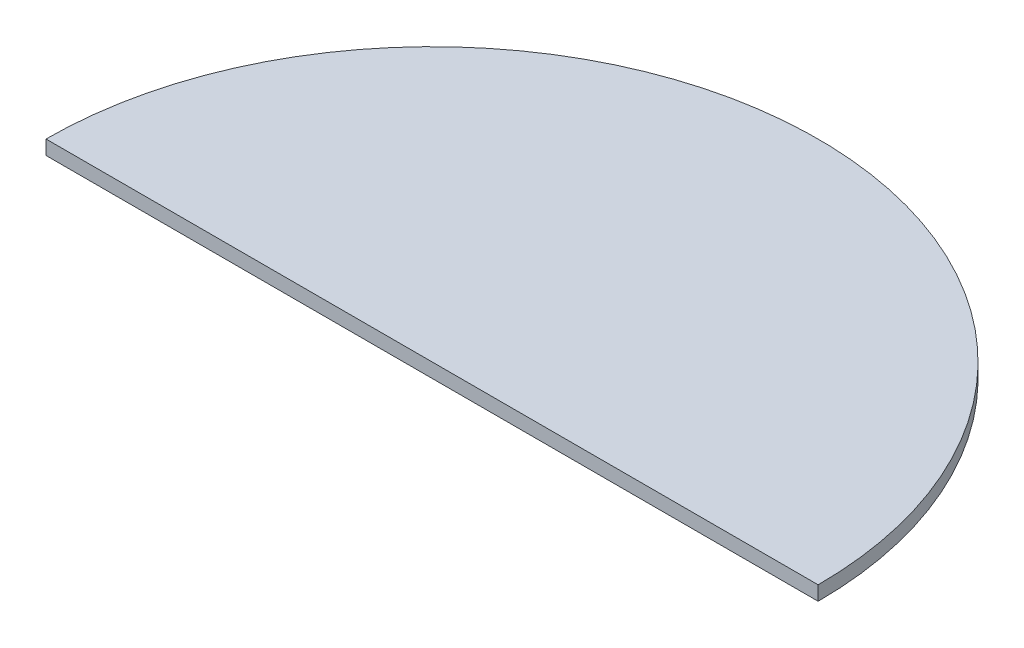
ISO-10303-21;
HEADER;
FILE_DESCRIPTION(('STEP AP214'),'2;1');
FILE_NAME('part.step','',(''),(''),'','','');
FILE_SCHEMA(('AUTOMOTIVE_DESIGN { 1 0 10303 214 1 1 1 1 }'));
ENDSEC;
DATA;
#1=APPLICATION_CONTEXT('core data for automotive mechanical design processes');
#2=APPLICATION_PROTOCOL_DEFINITION('international standard','automotive_design',2000,#1);
#3=PRODUCT_CONTEXT('',#1,'mechanical');
#4=PRODUCT('Part','Part','',(#3));
#5=PRODUCT_RELATED_PRODUCT_CATEGORY('part','',(#4));
#6=PRODUCT_DEFINITION_FORMATION('','',#4);
#7=PRODUCT_DEFINITION_CONTEXT('part definition',#1,'design');
#8=PRODUCT_DEFINITION('design','',#6,#7);
#9=PRODUCT_DEFINITION_SHAPE('','',#8);
#10=(LENGTH_UNIT() NAMED_UNIT(*) SI_UNIT(.MILLI.,.METRE.));
#11=(NAMED_UNIT(*) PLANE_ANGLE_UNIT() SI_UNIT($,.RADIAN.));
#12=(NAMED_UNIT(*) SI_UNIT($,.STERADIAN.) SOLID_ANGLE_UNIT());
#13=UNCERTAINTY_MEASURE_WITH_UNIT(LENGTH_MEASURE(1.E-05),#10,'distance_accuracy_value','');
#14=(GEOMETRIC_REPRESENTATION_CONTEXT(3) GLOBAL_UNCERTAINTY_ASSIGNED_CONTEXT((#13)) GLOBAL_UNIT_ASSIGNED_CONTEXT((#10,
#11,#12)) REPRESENTATION_CONTEXT('',''));
#15=CARTESIAN_POINT('',(0.,0.,0.));
#16=DIRECTION('',(0.,0.,1.));
#17=DIRECTION('',(1.,0.,0.));
#18=AXIS2_PLACEMENT_3D('',#15,#16,#17);
#19=CARTESIAN_POINT('',(0.,0.5,0.));
#20=DIRECTION('',(0.,-1.,0.));
#21=DIRECTION('',(0.,0.,-1.));
#22=AXIS2_PLACEMENT_3D('',#19,#20,#21);
#23=CYLINDRICAL_SURFACE('',#22,13.5);
#24=CARTESIAN_POINT('',(0.,0.,0.));
#25=DIRECTION('',(0.,1.,0.));
#26=DIRECTION('',(0.,0.,1.));
#27=AXIS2_PLACEMENT_3D('',#24,#25,#26);
#28=CIRCLE('',#27,13.5);
#29=CARTESIAN_POINT('',(13.5,0.,0.));
#30=VERTEX_POINT('',#29);
#31=CARTESIAN_POINT('',(-13.5,0.,0.));
#32=VERTEX_POINT('',#31);
#33=EDGE_CURVE('E64',#30,#32,#28,.T.);
#34=ORIENTED_EDGE('',*,*,#33,.T.);
#35=DIRECTION('',(0.,-1.,0.));
#36=VECTOR('',#35,1.);
#37=CARTESIAN_POINT('',(-13.5,0.5,0.));
#38=LINE('',#37,#36);
#39=CARTESIAN_POINT('',(-13.5,0.5,0.));
#40=VERTEX_POINT('',#39);
#41=EDGE_CURVE('E11',#40,#32,#38,.T.);
#42=ORIENTED_EDGE('',*,*,#41,.F.);
#43=CARTESIAN_POINT('',(0.,0.5,0.));
#44=DIRECTION('',(0.,1.,0.));
#45=DIRECTION('',(0.,0.,1.));
#46=AXIS2_PLACEMENT_3D('',#43,#44,#45);
#47=CIRCLE('',#46,13.5);
#48=CARTESIAN_POINT('',(13.5,0.5,0.));
#49=VERTEX_POINT('',#48);
#50=EDGE_CURVE('E63',#49,#40,#47,.T.);
#51=ORIENTED_EDGE('',*,*,#50,.F.);
#52=DIRECTION('',(0.,-1.,0.));
#53=VECTOR('',#52,1.);
#54=CARTESIAN_POINT('',(13.5,0.5,0.));
#55=LINE('',#54,#53);
#56=EDGE_CURVE('E41',#49,#30,#55,.T.);
#57=ORIENTED_EDGE('',*,*,#56,.T.);
#58=EDGE_LOOP('',(#34,#42,#51,#57));
#59=FACE_BOUND('',#58,.T.);
#60=ADVANCED_FACE('F33',(#59),#23,.T.);
#61=CARTESIAN_POINT('',(-13.5,0.5,0.));
#62=DIRECTION('',(0.,0.,-1.));
#63=DIRECTION('',(-1.,0.,0.));
#64=AXIS2_PLACEMENT_3D('',#61,#62,#63);
#65=PLANE('',#64);
#66=DIRECTION('',(1.,0.,0.));
#67=VECTOR('',#66,1.);
#68=CARTESIAN_POINT('',(-13.5,0.,0.));
#69=LINE('',#68,#67);
#70=EDGE_CURVE('E56',#32,#30,#69,.T.);
#71=ORIENTED_EDGE('',*,*,#70,.T.);
#72=ORIENTED_EDGE('',*,*,#56,.F.);
#73=DIRECTION('',(1.,0.,0.));
#74=VECTOR('',#73,1.);
#75=CARTESIAN_POINT('',(-13.5,0.5,0.));
#76=LINE('',#75,#74);
#77=EDGE_CURVE('E48',#40,#49,#76,.T.);
#78=ORIENTED_EDGE('',*,*,#77,.F.);
#79=ORIENTED_EDGE('',*,*,#41,.T.);
#80=EDGE_LOOP('',(#71,#72,#78,#79));
#81=FACE_BOUND('',#80,.T.);
#82=ADVANCED_FACE('F59',(#81),#65,.F.);
#83=CARTESIAN_POINT('',(0.,0.5,0.));
#84=DIRECTION('',(0.,1.,0.));
#85=DIRECTION('',(0.,0.,1.));
#86=AXIS2_PLACEMENT_3D('',#83,#84,#85);
#87=PLANE('',#86);
#88=ORIENTED_EDGE('',*,*,#50,.T.);
#89=ORIENTED_EDGE('',*,*,#77,.T.);
#90=EDGE_LOOP('',(#88,#89));
#91=FACE_BOUND('',#90,.T.);
#92=ADVANCED_FACE('F71',(#91),#87,.T.);
#93=CARTESIAN_POINT('',(0.,0.,0.));
#94=DIRECTION('',(0.,1.,0.));
#95=DIRECTION('',(0.,0.,1.));
#96=AXIS2_PLACEMENT_3D('',#93,#94,#95);
#97=PLANE('',#96);
#98=ORIENTED_EDGE('',*,*,#33,.F.);
#99=ORIENTED_EDGE('',*,*,#70,.F.);
#100=EDGE_LOOP('',(#98,#99));
#101=FACE_BOUND('',#100,.T.);
#102=ADVANCED_FACE('F67',(#101),#97,.F.);
#103=CLOSED_SHELL('',(#60,#82,#92,#102));
#104=MANIFOLD_SOLID_BREP('B2',#103);
#105=ADVANCED_BREP_SHAPE_REPRESENTATION('',(#18,#104),#14);
#106=SHAPE_DEFINITION_REPRESENTATION(#9,#105);
ENDSEC;
END-ISO-10303-21;
